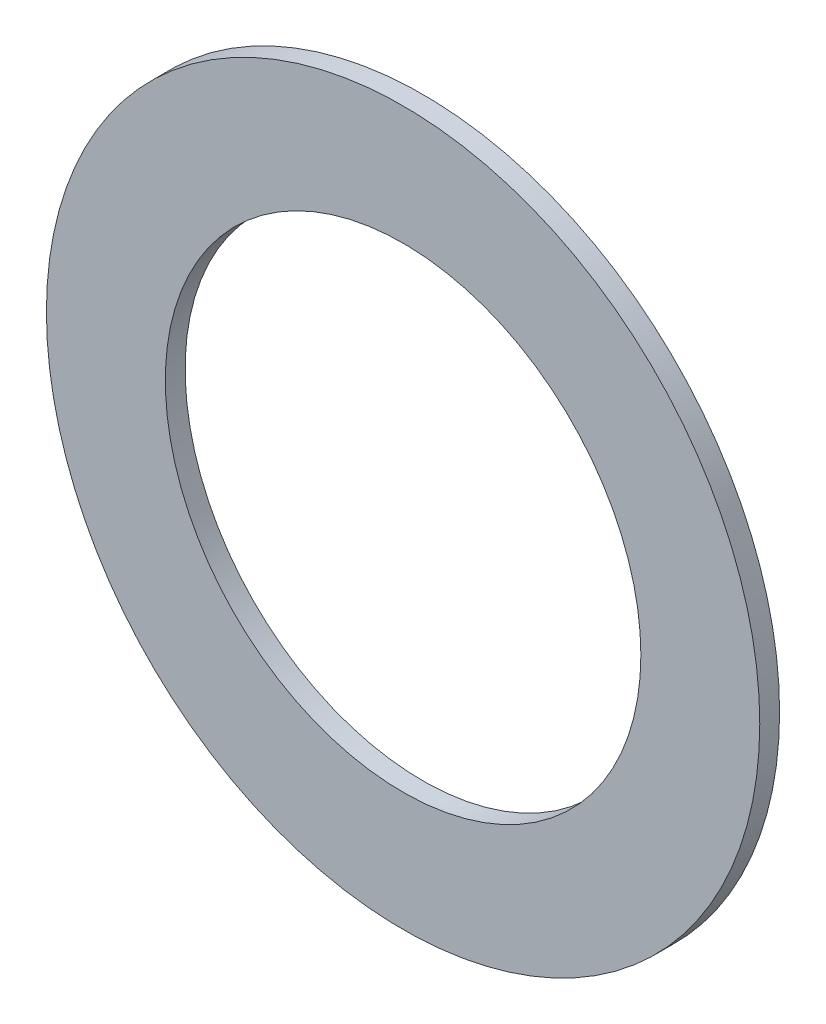
ISO-10303-21;
HEADER;
FILE_DESCRIPTION(('STEP AP214'),'2;1');
FILE_NAME('part.step','',(''),(''),'','','');
FILE_SCHEMA(('AUTOMOTIVE_DESIGN { 1 0 10303 214 1 1 1 1 }'));
ENDSEC;
DATA;
#1=APPLICATION_CONTEXT('core data for automotive mechanical design processes');
#2=APPLICATION_PROTOCOL_DEFINITION('international standard','automotive_design',2000,#1);
#3=PRODUCT_CONTEXT('',#1,'mechanical');
#4=PRODUCT('Part','Part','',(#3));
#5=PRODUCT_RELATED_PRODUCT_CATEGORY('part','',(#4));
#6=PRODUCT_DEFINITION_FORMATION('','',#4);
#7=PRODUCT_DEFINITION_CONTEXT('part definition',#1,'design');
#8=PRODUCT_DEFINITION('design','',#6,#7);
#9=PRODUCT_DEFINITION_SHAPE('','',#8);
#10=(LENGTH_UNIT() NAMED_UNIT(*) SI_UNIT(.MILLI.,.METRE.));
#11=(NAMED_UNIT(*) PLANE_ANGLE_UNIT() SI_UNIT($,.RADIAN.));
#12=(NAMED_UNIT(*) SI_UNIT($,.STERADIAN.) SOLID_ANGLE_UNIT());
#13=UNCERTAINTY_MEASURE_WITH_UNIT(LENGTH_MEASURE(1.E-05),#10,'distance_accuracy_value','');
#14=(GEOMETRIC_REPRESENTATION_CONTEXT(3) GLOBAL_UNCERTAINTY_ASSIGNED_CONTEXT((#13)) GLOBAL_UNIT_ASSIGNED_CONTEXT((#10,
#11,#12)) REPRESENTATION_CONTEXT('',''));
#15=CARTESIAN_POINT('',(0.,0.,0.));
#16=DIRECTION('',(0.,0.,1.));
#17=DIRECTION('',(1.,0.,0.));
#18=AXIS2_PLACEMENT_3D('',#15,#16,#17);
#19=CARTESIAN_POINT('',(0.,0.,0.25));
#20=DIRECTION('',(0.,0.,1.));
#21=DIRECTION('',(1.,0.,0.));
#22=AXIS2_PLACEMENT_3D('',#19,#20,#21);
#23=PLANE('',#22);
#24=CARTESIAN_POINT('',(0.,0.,0.25));
#25=DIRECTION('',(0.,0.,1.));
#26=DIRECTION('',(1.,0.,0.));
#27=AXIS2_PLACEMENT_3D('',#24,#25,#26);
#28=CIRCLE('',#27,9.);
#29=CARTESIAN_POINT('',(9.,0.,0.25));
#30=VERTEX_POINT('',#29);
#31=EDGE_CURVE('E10',#30,#30,#28,.T.);
#32=ORIENTED_EDGE('',*,*,#31,.T.);
#33=EDGE_LOOP('',(#32));
#34=FACE_BOUND('',#33,.T.);
#35=CARTESIAN_POINT('',(0.,0.,0.25));
#36=DIRECTION('',(0.,0.,1.));
#37=DIRECTION('',(1.,0.,0.));
#38=AXIS2_PLACEMENT_3D('',#35,#36,#37);
#39=CIRCLE('',#38,6.);
#40=CARTESIAN_POINT('',(6.,0.,0.25));
#41=VERTEX_POINT('',#40);
#42=EDGE_CURVE('E44',#41,#41,#39,.T.);
#43=ORIENTED_EDGE('',*,*,#42,.F.);
#44=EDGE_LOOP('',(#43));
#45=FACE_BOUND('',#44,.T.);
#46=ADVANCED_FACE('F33',(#34,#45),#23,.T.);
#47=CARTESIAN_POINT('',(0.,0.,-0.25));
#48=DIRECTION('',(0.,0.,1.));
#49=DIRECTION('',(1.,0.,0.));
#50=AXIS2_PLACEMENT_3D('',#47,#48,#49);
#51=PLANE('',#50);
#52=CARTESIAN_POINT('',(0.,0.,-0.25));
#53=DIRECTION('',(0.,0.,1.));
#54=DIRECTION('',(1.,0.,0.));
#55=AXIS2_PLACEMENT_3D('',#52,#53,#54);
#56=CIRCLE('',#55,9.);
#57=CARTESIAN_POINT('',(9.,0.,-0.25));
#58=VERTEX_POINT('',#57);
#59=EDGE_CURVE('E37',#58,#58,#56,.T.);
#60=ORIENTED_EDGE('',*,*,#59,.F.);
#61=EDGE_LOOP('',(#60));
#62=FACE_BOUND('',#61,.T.);
#63=CARTESIAN_POINT('',(0.,0.,-0.25));
#64=DIRECTION('',(0.,0.,1.));
#65=DIRECTION('',(1.,0.,0.));
#66=AXIS2_PLACEMENT_3D('',#63,#64,#65);
#67=CIRCLE('',#66,6.);
#68=CARTESIAN_POINT('',(6.,0.,-0.25));
#69=VERTEX_POINT('',#68);
#70=EDGE_CURVE('E46',#69,#69,#67,.T.);
#71=ORIENTED_EDGE('',*,*,#70,.T.);
#72=EDGE_LOOP('',(#71));
#73=FACE_BOUND('',#72,.T.);
#74=ADVANCED_FACE('F56',(#62,#73),#51,.F.);
#75=CARTESIAN_POINT('',(0.,0.,0.25));
#76=DIRECTION('',(0.,0.,-1.));
#77=DIRECTION('',(-1.,0.,0.));
#78=AXIS2_PLACEMENT_3D('',#75,#76,#77);
#79=CYLINDRICAL_SURFACE('',#78,9.);
#80=ORIENTED_EDGE('',*,*,#31,.F.);
#81=EDGE_LOOP('',(#80));
#82=FACE_BOUND('',#81,.T.);
#83=ORIENTED_EDGE('',*,*,#59,.T.);
#84=EDGE_LOOP('',(#83));
#85=FACE_BOUND('',#84,.T.);
#86=ADVANCED_FACE('F35',(#82,#85),#79,.T.);
#87=CARTESIAN_POINT('',(0.,0.,0.25));
#88=DIRECTION('',(0.,0.,-1.));
#89=DIRECTION('',(-1.,0.,0.));
#90=AXIS2_PLACEMENT_3D('',#87,#88,#89);
#91=CYLINDRICAL_SURFACE('',#90,6.);
#92=ORIENTED_EDGE('',*,*,#42,.T.);
#93=EDGE_LOOP('',(#92));
#94=FACE_BOUND('',#93,.T.);
#95=ORIENTED_EDGE('',*,*,#70,.F.);
#96=EDGE_LOOP('',(#95));
#97=FACE_BOUND('',#96,.T.);
#98=ADVANCED_FACE('F52',(#94,#97),#91,.F.);
#99=CLOSED_SHELL('',(#46,#74,#86,#98));
#100=MANIFOLD_SOLID_BREP('B2',#99);
#101=ADVANCED_BREP_SHAPE_REPRESENTATION('',(#18,#100),#14);
#102=SHAPE_DEFINITION_REPRESENTATION(#9,#101);
ENDSEC;
END-ISO-10303-21;
